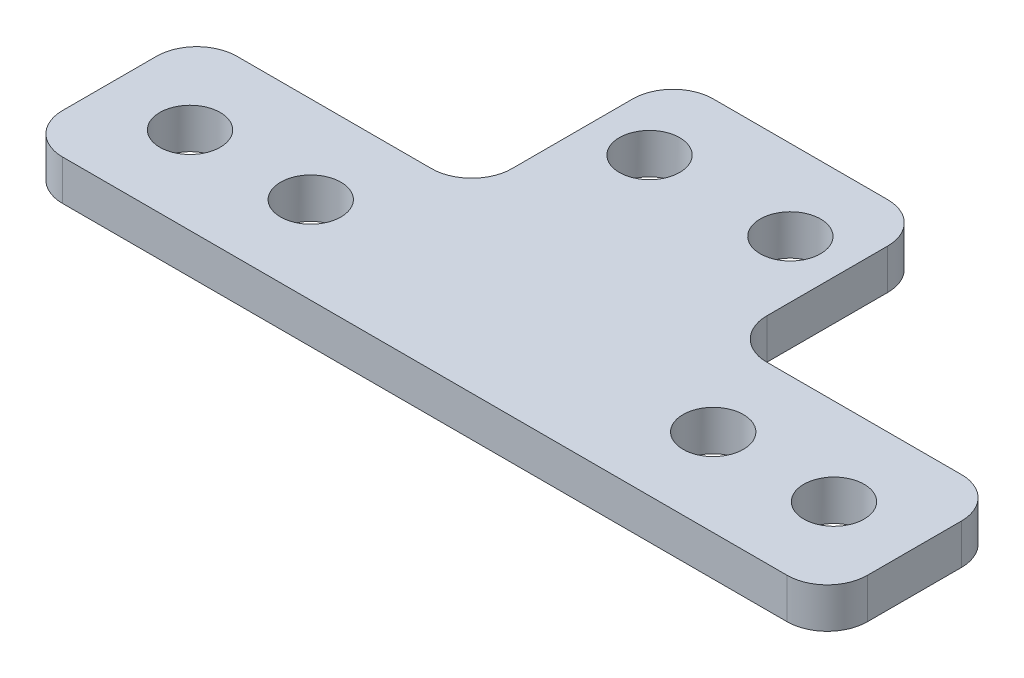
ISO-10303-21;
HEADER;
FILE_DESCRIPTION(('STEP AP214'),'2;1');
FILE_NAME('part.step','',(''),(''),'','','');
FILE_SCHEMA(('AUTOMOTIVE_DESIGN { 1 0 10303 214 1 1 1 1 }'));
ENDSEC;
DATA;
#1=APPLICATION_CONTEXT('core data for automotive mechanical design processes');
#2=APPLICATION_PROTOCOL_DEFINITION('international standard','automotive_design',2000,#1);
#3=PRODUCT_CONTEXT('',#1,'mechanical');
#4=PRODUCT('Part','Part','',(#3));
#5=PRODUCT_RELATED_PRODUCT_CATEGORY('part','',(#4));
#6=PRODUCT_DEFINITION_FORMATION('','',#4);
#7=PRODUCT_DEFINITION_CONTEXT('part definition',#1,'design');
#8=PRODUCT_DEFINITION('design','',#6,#7);
#9=PRODUCT_DEFINITION_SHAPE('','',#8);
#10=(LENGTH_UNIT() NAMED_UNIT(*) SI_UNIT(.MILLI.,.METRE.));
#11=(NAMED_UNIT(*) PLANE_ANGLE_UNIT() SI_UNIT($,.RADIAN.));
#12=(NAMED_UNIT(*) SI_UNIT($,.STERADIAN.) SOLID_ANGLE_UNIT());
#13=UNCERTAINTY_MEASURE_WITH_UNIT(LENGTH_MEASURE(1.E-05),#10,'distance_accuracy_value','');
#14=(GEOMETRIC_REPRESENTATION_CONTEXT(3) GLOBAL_UNCERTAINTY_ASSIGNED_CONTEXT((#13)) GLOBAL_UNIT_ASSIGNED_CONTEXT((#10,
#11,#12)) REPRESENTATION_CONTEXT('',''));
#15=CARTESIAN_POINT('',(0.,0.,0.));
#16=DIRECTION('',(0.,0.,1.));
#17=DIRECTION('',(1.,0.,0.));
#18=AXIS2_PLACEMENT_3D('',#15,#16,#17);
#19=CARTESIAN_POINT('',(-9.5,-3.,-15.));
#20=DIRECTION('',(-1.,0.,0.));
#21=DIRECTION('',(0.,0.,1.));
#22=AXIS2_PLACEMENT_3D('',#19,#20,#21);
#23=PLANE('',#22);
#24=DIRECTION('',(0.,0.,1.));
#25=VECTOR('',#24,1.);
#26=CARTESIAN_POINT('',(-9.5,-3.,-15.));
#27=LINE('',#26,#25);
#28=CARTESIAN_POINT('',(-9.5,-3.,-12.));
#29=VERTEX_POINT('',#28);
#30=CARTESIAN_POINT('',(-9.5,-3.,-3.));
#31=VERTEX_POINT('',#30);
#32=EDGE_CURVE('E305',#29,#31,#27,.T.);
#33=ORIENTED_EDGE('',*,*,#32,.T.);
#34=DIRECTION('',(0.,1.,0.));
#35=VECTOR('',#34,1.);
#36=CARTESIAN_POINT('',(-9.5,0.,-3.));
#37=LINE('',#36,#35);
#38=CARTESIAN_POINT('',(-9.5,0.,-3.));
#39=VERTEX_POINT('',#38);
#40=EDGE_CURVE('E171',#31,#39,#37,.T.);
#41=ORIENTED_EDGE('',*,*,#40,.T.);
#42=DIRECTION('',(0.,0.,1.));
#43=VECTOR('',#42,1.);
#44=CARTESIAN_POINT('',(-9.5,0.,-15.));
#45=LINE('',#44,#43);
#46=CARTESIAN_POINT('',(-9.5,0.,-12.));
#47=VERTEX_POINT('',#46);
#48=EDGE_CURVE('E155',#47,#39,#45,.T.);
#49=ORIENTED_EDGE('',*,*,#48,.F.);
#50=DIRECTION('',(0.,1.,0.));
#51=VECTOR('',#50,1.);
#52=CARTESIAN_POINT('',(-9.5,-3.,-12.));
#53=LINE('',#52,#51);
#54=EDGE_CURVE('E168',#47,#29,#53,.F.);
#55=ORIENTED_EDGE('',*,*,#54,.T.);
#56=EDGE_LOOP('',(#33,#41,#49,#55));
#57=FACE_BOUND('',#56,.T.);
#58=ADVANCED_FACE('F38',(#57),#23,.T.);
#59=CARTESIAN_POINT('',(9.5,-3.,-15.));
#60=DIRECTION('',(0.,0.,-1.));
#61=DIRECTION('',(-1.,0.,0.));
#62=AXIS2_PLACEMENT_3D('',#59,#60,#61);
#63=PLANE('',#62);
#64=DIRECTION('',(-1.,0.,0.));
#65=VECTOR('',#64,1.);
#66=CARTESIAN_POINT('',(9.5,-3.,-15.));
#67=LINE('',#66,#65);
#68=CARTESIAN_POINT('',(6.5,-3.,-15.));
#69=VERTEX_POINT('',#68);
#70=CARTESIAN_POINT('',(-6.5,-3.,-15.));
#71=VERTEX_POINT('',#70);
#72=EDGE_CURVE('E178',#69,#71,#67,.T.);
#73=ORIENTED_EDGE('',*,*,#72,.T.);
#74=DIRECTION('',(0.,1.,0.));
#75=VECTOR('',#74,1.);
#76=CARTESIAN_POINT('',(-6.5,-3.,-15.));
#77=LINE('',#76,#75);
#78=CARTESIAN_POINT('',(-6.5,0.,-15.));
#79=VERTEX_POINT('',#78);
#80=EDGE_CURVE('E204',#71,#79,#77,.T.);
#81=ORIENTED_EDGE('',*,*,#80,.T.);
#82=DIRECTION('',(-1.,0.,0.));
#83=VECTOR('',#82,1.);
#84=CARTESIAN_POINT('',(9.5,0.,-15.));
#85=LINE('',#84,#83);
#86=CARTESIAN_POINT('',(6.5,0.,-15.));
#87=VERTEX_POINT('',#86);
#88=EDGE_CURVE('E157',#87,#79,#85,.T.);
#89=ORIENTED_EDGE('',*,*,#88,.F.);
#90=DIRECTION('',(0.,1.,0.));
#91=VECTOR('',#90,1.);
#92=CARTESIAN_POINT('',(6.5,-3.,-15.));
#93=LINE('',#92,#91);
#94=EDGE_CURVE('E202',#87,#69,#93,.F.);
#95=ORIENTED_EDGE('',*,*,#94,.T.);
#96=EDGE_LOOP('',(#73,#81,#89,#95));
#97=FACE_BOUND('',#96,.T.);
#98=ADVANCED_FACE('F371',(#97),#63,.T.);
#99=CARTESIAN_POINT('',(9.5,-3.,-15.));
#100=DIRECTION('',(1.,0.,0.));
#101=DIRECTION('',(0.,0.,-1.));
#102=AXIS2_PLACEMENT_3D('',#99,#100,#101);
#103=PLANE('',#102);
#104=DIRECTION('',(0.,0.,-1.));
#105=VECTOR('',#104,1.);
#106=CARTESIAN_POINT('',(9.5,0.,-15.));
#107=LINE('',#106,#105);
#108=CARTESIAN_POINT('',(9.5,0.,-3.));
#109=VERTEX_POINT('',#108);
#110=CARTESIAN_POINT('',(9.5,0.,-12.));
#111=VERTEX_POINT('',#110);
#112=EDGE_CURVE('E244',#109,#111,#107,.T.);
#113=ORIENTED_EDGE('',*,*,#112,.F.);
#114=DIRECTION('',(0.,1.,0.));
#115=VECTOR('',#114,1.);
#116=CARTESIAN_POINT('',(9.5,-3.,-3.));
#117=LINE('',#116,#115);
#118=CARTESIAN_POINT('',(9.5,-3.,-3.));
#119=VERTEX_POINT('',#118);
#120=EDGE_CURVE('E200',#109,#119,#117,.F.);
#121=ORIENTED_EDGE('',*,*,#120,.T.);
#122=DIRECTION('',(0.,0.,-1.));
#123=VECTOR('',#122,1.);
#124=CARTESIAN_POINT('',(9.5,-3.,-15.));
#125=LINE('',#124,#123);
#126=CARTESIAN_POINT('',(9.5,-3.,-12.));
#127=VERTEX_POINT('',#126);
#128=EDGE_CURVE('E183',#119,#127,#125,.T.);
#129=ORIENTED_EDGE('',*,*,#128,.T.);
#130=DIRECTION('',(0.,1.,0.));
#131=VECTOR('',#130,1.);
#132=CARTESIAN_POINT('',(9.5,-3.,-12.));
#133=LINE('',#132,#131);
#134=EDGE_CURVE('E197',#127,#111,#133,.T.);
#135=ORIENTED_EDGE('',*,*,#134,.T.);
#136=EDGE_LOOP('',(#113,#121,#129,#135));
#137=FACE_BOUND('',#136,.T.);
#138=ADVANCED_FACE('F251',(#137),#103,.T.);
#139=CARTESIAN_POINT('',(9.5,-3.,0.));
#140=DIRECTION('',(0.,0.,-1.));
#141=DIRECTION('',(-1.,0.,0.));
#142=AXIS2_PLACEMENT_3D('',#139,#140,#141);
#143=PLANE('',#142);
#144=DIRECTION('',(-1.,0.,0.));
#145=VECTOR('',#144,1.);
#146=CARTESIAN_POINT('',(9.5,-3.,0.));
#147=LINE('',#146,#145);
#148=CARTESIAN_POINT('',(27.,-3.,0.));
#149=VERTEX_POINT('',#148);
#150=CARTESIAN_POINT('',(12.5,-3.,0.));
#151=VERTEX_POINT('',#150);
#152=EDGE_CURVE('E260',#149,#151,#147,.T.);
#153=ORIENTED_EDGE('',*,*,#152,.T.);
#154=DIRECTION('',(0.,1.,0.));
#155=VECTOR('',#154,1.);
#156=CARTESIAN_POINT('',(12.5,0.,0.));
#157=LINE('',#156,#155);
#158=CARTESIAN_POINT('',(12.5,0.,0.));
#159=VERTEX_POINT('',#158);
#160=EDGE_CURVE('E194',#151,#159,#157,.T.);
#161=ORIENTED_EDGE('',*,*,#160,.T.);
#162=DIRECTION('',(-1.,0.,0.));
#163=VECTOR('',#162,1.);
#164=CARTESIAN_POINT('',(9.5,0.,0.));
#165=LINE('',#164,#163);
#166=CARTESIAN_POINT('',(27.,0.,0.));
#167=VERTEX_POINT('',#166);
#168=EDGE_CURVE('E246',#167,#159,#165,.T.);
#169=ORIENTED_EDGE('',*,*,#168,.F.);
#170=DIRECTION('',(0.,1.,0.));
#171=VECTOR('',#170,1.);
#172=CARTESIAN_POINT('',(27.,-3.,0.));
#173=LINE('',#172,#171);
#174=EDGE_CURVE('E192',#167,#149,#173,.F.);
#175=ORIENTED_EDGE('',*,*,#174,.T.);
#176=EDGE_LOOP('',(#153,#161,#169,#175));
#177=FACE_BOUND('',#176,.T.);
#178=ADVANCED_FACE('F263',(#177),#143,.T.);
#179=CARTESIAN_POINT('',(30.,-3.,0.));
#180=DIRECTION('',(1.,0.,0.));
#181=DIRECTION('',(0.,0.,-1.));
#182=AXIS2_PLACEMENT_3D('',#179,#180,#181);
#183=PLANE('',#182);
#184=DIRECTION('',(0.,0.,-1.));
#185=VECTOR('',#184,1.);
#186=CARTESIAN_POINT('',(30.,0.,0.));
#187=LINE('',#186,#185);
#188=CARTESIAN_POINT('',(30.,0.,10.));
#189=VERTEX_POINT('',#188);
#190=CARTESIAN_POINT('',(30.,0.,3.));
#191=VERTEX_POINT('',#190);
#192=EDGE_CURVE('E281',#189,#191,#187,.T.);
#193=ORIENTED_EDGE('',*,*,#192,.F.);
#194=DIRECTION('',(0.,1.,0.));
#195=VECTOR('',#194,1.);
#196=CARTESIAN_POINT('',(30.,-3.,10.));
#197=LINE('',#196,#195);
#198=CARTESIAN_POINT('',(30.,-3.,10.));
#199=VERTEX_POINT('',#198);
#200=EDGE_CURVE('E232',#189,#199,#197,.F.);
#201=ORIENTED_EDGE('',*,*,#200,.T.);
#202=DIRECTION('',(0.,0.,-1.));
#203=VECTOR('',#202,1.);
#204=CARTESIAN_POINT('',(30.,-3.,0.));
#205=LINE('',#204,#203);
#206=CARTESIAN_POINT('',(30.,-3.,3.));
#207=VERTEX_POINT('',#206);
#208=EDGE_CURVE('E265',#199,#207,#205,.T.);
#209=ORIENTED_EDGE('',*,*,#208,.T.);
#210=DIRECTION('',(0.,1.,0.));
#211=VECTOR('',#210,1.);
#212=CARTESIAN_POINT('',(30.,-3.,3.));
#213=LINE('',#212,#211);
#214=EDGE_CURVE('E229',#207,#191,#213,.T.);
#215=ORIENTED_EDGE('',*,*,#214,.T.);
#216=EDGE_LOOP('',(#193,#201,#209,#215));
#217=FACE_BOUND('',#216,.T.);
#218=ADVANCED_FACE('F287',(#217),#183,.T.);
#219=CARTESIAN_POINT('',(-30.,-3.,13.));
#220=DIRECTION('',(0.,0.,1.));
#221=DIRECTION('',(1.,0.,0.));
#222=AXIS2_PLACEMENT_3D('',#219,#220,#221);
#223=PLANE('',#222);
#224=DIRECTION('',(1.,0.,0.));
#225=VECTOR('',#224,1.);
#226=CARTESIAN_POINT('',(-30.,-3.,13.));
#227=LINE('',#226,#225);
#228=CARTESIAN_POINT('',(-27.,-3.,13.));
#229=VERTEX_POINT('',#228);
#230=CARTESIAN_POINT('',(27.,-3.,13.));
#231=VERTEX_POINT('',#230);
#232=EDGE_CURVE('E269',#229,#231,#227,.T.);
#233=ORIENTED_EDGE('',*,*,#232,.T.);
#234=DIRECTION('',(0.,1.,0.));
#235=VECTOR('',#234,1.);
#236=CARTESIAN_POINT('',(27.,-3.,13.));
#237=LINE('',#236,#235);
#238=CARTESIAN_POINT('',(27.,0.,13.));
#239=VERTEX_POINT('',#238);
#240=EDGE_CURVE('E226',#231,#239,#237,.T.);
#241=ORIENTED_EDGE('',*,*,#240,.T.);
#242=DIRECTION('',(1.,0.,0.));
#243=VECTOR('',#242,1.);
#244=CARTESIAN_POINT('',(-30.,0.,13.));
#245=LINE('',#244,#243);
#246=CARTESIAN_POINT('',(-27.,0.,13.));
#247=VERTEX_POINT('',#246);
#248=EDGE_CURVE('E278',#247,#239,#245,.T.);
#249=ORIENTED_EDGE('',*,*,#248,.F.);
#250=DIRECTION('',(0.,1.,0.));
#251=VECTOR('',#250,1.);
#252=CARTESIAN_POINT('',(-27.,-3.,13.));
#253=LINE('',#252,#251);
#254=EDGE_CURVE('E224',#247,#229,#253,.F.);
#255=ORIENTED_EDGE('',*,*,#254,.T.);
#256=EDGE_LOOP('',(#233,#241,#249,#255));
#257=FACE_BOUND('',#256,.T.);
#258=ADVANCED_FACE('F296',(#257),#223,.T.);
#259=CARTESIAN_POINT('',(-30.,-3.,0.));
#260=DIRECTION('',(-1.,0.,0.));
#261=DIRECTION('',(0.,0.,1.));
#262=AXIS2_PLACEMENT_3D('',#259,#260,#261);
#263=PLANE('',#262);
#264=DIRECTION('',(0.,0.,1.));
#265=VECTOR('',#264,1.);
#266=CARTESIAN_POINT('',(-30.,-3.,0.));
#267=LINE('',#266,#265);
#268=CARTESIAN_POINT('',(-30.,-3.,3.));
#269=VERTEX_POINT('',#268);
#270=CARTESIAN_POINT('',(-30.,-3.,10.));
#271=VERTEX_POINT('',#270);
#272=EDGE_CURVE('E299',#269,#271,#267,.T.);
#273=ORIENTED_EDGE('',*,*,#272,.T.);
#274=DIRECTION('',(0.,1.,0.));
#275=VECTOR('',#274,1.);
#276=CARTESIAN_POINT('',(-30.,-3.,10.));
#277=LINE('',#276,#275);
#278=CARTESIAN_POINT('',(-30.,0.,10.));
#279=VERTEX_POINT('',#278);
#280=EDGE_CURVE('E235',#271,#279,#277,.T.);
#281=ORIENTED_EDGE('',*,*,#280,.T.);
#282=DIRECTION('',(0.,0.,1.));
#283=VECTOR('',#282,1.);
#284=CARTESIAN_POINT('',(-30.,0.,0.));
#285=LINE('',#284,#283);
#286=CARTESIAN_POINT('',(-30.,0.,3.));
#287=VERTEX_POINT('',#286);
#288=EDGE_CURVE('E275',#287,#279,#285,.T.);
#289=ORIENTED_EDGE('',*,*,#288,.F.);
#290=DIRECTION('',(0.,1.,0.));
#291=VECTOR('',#290,1.);
#292=CARTESIAN_POINT('',(-30.,-3.,3.));
#293=LINE('',#292,#291);
#294=EDGE_CURVE('E60',#287,#269,#293,.F.);
#295=ORIENTED_EDGE('',*,*,#294,.T.);
#296=EDGE_LOOP('',(#273,#281,#289,#295));
#297=FACE_BOUND('',#296,.T.);
#298=ADVANCED_FACE('F407',(#297),#263,.T.);
#299=CARTESIAN_POINT('',(-9.5,-3.,0.));
#300=DIRECTION('',(0.,0.,-1.));
#301=DIRECTION('',(-1.,0.,0.));
#302=AXIS2_PLACEMENT_3D('',#299,#300,#301);
#303=PLANE('',#302);
#304=DIRECTION('',(-1.,0.,0.));
#305=VECTOR('',#304,1.);
#306=CARTESIAN_POINT('',(-9.5,0.,0.));
#307=LINE('',#306,#305);
#308=CARTESIAN_POINT('',(-12.5,0.,0.));
#309=VERTEX_POINT('',#308);
#310=CARTESIAN_POINT('',(-27.,0.,0.));
#311=VERTEX_POINT('',#310);
#312=EDGE_CURVE('E172',#309,#311,#307,.T.);
#313=ORIENTED_EDGE('',*,*,#312,.F.);
#314=DIRECTION('',(0.,1.,0.));
#315=VECTOR('',#314,1.);
#316=CARTESIAN_POINT('',(-12.5,-3.,0.));
#317=LINE('',#316,#315);
#318=CARTESIAN_POINT('',(-12.5,-3.,0.));
#319=VERTEX_POINT('',#318);
#320=EDGE_CURVE('E190',#309,#319,#317,.F.);
#321=ORIENTED_EDGE('',*,*,#320,.T.);
#322=DIRECTION('',(-1.,0.,0.));
#323=VECTOR('',#322,1.);
#324=CARTESIAN_POINT('',(-9.5,-3.,0.));
#325=LINE('',#324,#323);
#326=CARTESIAN_POINT('',(-27.,-3.,0.));
#327=VERTEX_POINT('',#326);
#328=EDGE_CURVE('E300',#319,#327,#325,.T.);
#329=ORIENTED_EDGE('',*,*,#328,.T.);
#330=DIRECTION('',(0.,1.,0.));
#331=VECTOR('',#330,1.);
#332=CARTESIAN_POINT('',(-27.,-3.,0.));
#333=LINE('',#332,#331);
#334=EDGE_CURVE('E180',#327,#311,#333,.T.);
#335=ORIENTED_EDGE('',*,*,#334,.T.);
#336=EDGE_LOOP('',(#313,#321,#329,#335));
#337=FACE_BOUND('',#336,.T.);
#338=ADVANCED_FACE('F380',(#337),#303,.T.);
#339=CARTESIAN_POINT('',(0.,-3.,0.));
#340=DIRECTION('',(0.,-1.,0.));
#341=DIRECTION('',(0.,0.,-1.));
#342=AXIS2_PLACEMENT_3D('',#339,#340,#341);
#343=PLANE('',#342);
#344=CARTESIAN_POINT('',(-5.25,-3.,-9.));
#345=DIRECTION('',(0.,-1.,0.));
#346=DIRECTION('',(0.,0.,-1.));
#347=AXIS2_PLACEMENT_3D('',#344,#345,#346);
#348=CIRCLE('',#347,2.25);
#349=CARTESIAN_POINT('',(-5.25,-3.,-11.25));
#350=VERTEX_POINT('',#349);
#351=EDGE_CURVE('E336',#350,#350,#348,.T.);
#352=ORIENTED_EDGE('',*,*,#351,.F.);
#353=EDGE_LOOP('',(#352));
#354=FACE_BOUND('',#353,.T.);
#355=CARTESIAN_POINT('',(5.25,-3.,-9.));
#356=DIRECTION('',(0.,-1.,0.));
#357=DIRECTION('',(0.,0.,-1.));
#358=AXIS2_PLACEMENT_3D('',#355,#356,#357);
#359=CIRCLE('',#358,2.25);
#360=CARTESIAN_POINT('',(5.25,-3.,-11.25));
#361=VERTEX_POINT('',#360);
#362=EDGE_CURVE('E330',#361,#361,#359,.T.);
#363=ORIENTED_EDGE('',*,*,#362,.F.);
#364=EDGE_LOOP('',(#363));
#365=FACE_BOUND('',#364,.T.);
#366=CARTESIAN_POINT('',(-15.,-3.,6.5));
#367=DIRECTION('',(0.,-1.,0.));
#368=DIRECTION('',(0.,0.,-1.));
#369=AXIS2_PLACEMENT_3D('',#366,#367,#368);
#370=CIRCLE('',#369,2.25);
#371=CARTESIAN_POINT('',(-15.,-3.,4.25));
#372=VERTEX_POINT('',#371);
#373=EDGE_CURVE('E324',#372,#372,#370,.T.);
#374=ORIENTED_EDGE('',*,*,#373,.F.);
#375=EDGE_LOOP('',(#374));
#376=FACE_BOUND('',#375,.T.);
#377=CARTESIAN_POINT('',(15.,-3.,6.5));
#378=DIRECTION('',(0.,-1.,0.));
#379=DIRECTION('',(0.,0.,-1.));
#380=AXIS2_PLACEMENT_3D('',#377,#378,#379);
#381=CIRCLE('',#380,2.25);
#382=CARTESIAN_POINT('',(15.,-3.,4.25));
#383=VERTEX_POINT('',#382);
#384=EDGE_CURVE('E318',#383,#383,#381,.T.);
#385=ORIENTED_EDGE('',*,*,#384,.F.);
#386=EDGE_LOOP('',(#385));
#387=FACE_BOUND('',#386,.T.);
#388=CARTESIAN_POINT('',(-24.,-3.,6.5));
#389=DIRECTION('',(0.,-1.,0.));
#390=DIRECTION('',(0.,0.,-1.));
#391=AXIS2_PLACEMENT_3D('',#388,#389,#390);
#392=CIRCLE('',#391,2.25);
#393=CARTESIAN_POINT('',(-24.,-3.,4.25));
#394=VERTEX_POINT('',#393);
#395=EDGE_CURVE('E312',#394,#394,#392,.T.);
#396=ORIENTED_EDGE('',*,*,#395,.F.);
#397=EDGE_LOOP('',(#396));
#398=FACE_BOUND('',#397,.T.);
#399=CARTESIAN_POINT('',(24.,-3.,6.5));
#400=DIRECTION('',(0.,-1.,0.));
#401=DIRECTION('',(0.,0.,-1.));
#402=AXIS2_PLACEMENT_3D('',#399,#400,#401);
#403=CIRCLE('',#402,2.25);
#404=CARTESIAN_POINT('',(24.,-3.,4.25));
#405=VERTEX_POINT('',#404);
#406=EDGE_CURVE('E173',#405,#405,#403,.T.);
#407=ORIENTED_EDGE('',*,*,#406,.F.);
#408=EDGE_LOOP('',(#407));
#409=FACE_BOUND('',#408,.T.);
#410=ORIENTED_EDGE('',*,*,#32,.F.);
#411=CARTESIAN_POINT('',(-6.5,-3.,-12.));
#412=DIRECTION('',(0.,-1.,0.));
#413=DIRECTION('',(0.,0.,-1.));
#414=AXIS2_PLACEMENT_3D('',#411,#412,#413);
#415=CIRCLE('',#414,3.);
#416=EDGE_CURVE('E177',#29,#71,#415,.T.);
#417=ORIENTED_EDGE('',*,*,#416,.T.);
#418=ORIENTED_EDGE('',*,*,#72,.F.);
#419=CARTESIAN_POINT('',(6.5,-3.,-12.));
#420=DIRECTION('',(0.,-1.,0.));
#421=DIRECTION('',(0.,0.,-1.));
#422=AXIS2_PLACEMENT_3D('',#419,#420,#421);
#423=CIRCLE('',#422,3.);
#424=EDGE_CURVE('E221',#69,#127,#423,.T.);
#425=ORIENTED_EDGE('',*,*,#424,.T.);
#426=ORIENTED_EDGE('',*,*,#128,.F.);
#427=CARTESIAN_POINT('',(12.5,-3.,-3.));
#428=DIRECTION('',(0.,-1.,0.));
#429=DIRECTION('',(0.,0.,-1.));
#430=AXIS2_PLACEMENT_3D('',#427,#428,#429);
#431=CIRCLE('',#430,3.);
#432=EDGE_CURVE('E11',#119,#151,#431,.F.);
#433=ORIENTED_EDGE('',*,*,#432,.T.);
#434=ORIENTED_EDGE('',*,*,#152,.F.);
#435=CARTESIAN_POINT('',(27.,-3.,3.));
#436=DIRECTION('',(0.,-1.,0.));
#437=DIRECTION('',(0.,0.,-1.));
#438=AXIS2_PLACEMENT_3D('',#435,#436,#437);
#439=CIRCLE('',#438,3.);
#440=EDGE_CURVE('E217',#149,#207,#439,.T.);
#441=ORIENTED_EDGE('',*,*,#440,.T.);
#442=ORIENTED_EDGE('',*,*,#208,.F.);
#443=CARTESIAN_POINT('',(27.,-3.,10.));
#444=DIRECTION('',(0.,-1.,0.));
#445=DIRECTION('',(0.,0.,-1.));
#446=AXIS2_PLACEMENT_3D('',#443,#444,#445);
#447=CIRCLE('',#446,3.);
#448=EDGE_CURVE('E219',#199,#231,#447,.T.);
#449=ORIENTED_EDGE('',*,*,#448,.T.);
#450=ORIENTED_EDGE('',*,*,#232,.F.);
#451=CARTESIAN_POINT('',(-27.,-3.,10.));
#452=DIRECTION('',(0.,-1.,0.));
#453=DIRECTION('',(0.,0.,-1.));
#454=AXIS2_PLACEMENT_3D('',#451,#452,#453);
#455=CIRCLE('',#454,3.);
#456=EDGE_CURVE('E53',#229,#271,#455,.T.);
#457=ORIENTED_EDGE('',*,*,#456,.T.);
#458=ORIENTED_EDGE('',*,*,#272,.F.);
#459=CARTESIAN_POINT('',(-27.,-3.,3.));
#460=DIRECTION('',(0.,-1.,0.));
#461=DIRECTION('',(0.,0.,-1.));
#462=AXIS2_PLACEMENT_3D('',#459,#460,#461);
#463=CIRCLE('',#462,3.);
#464=EDGE_CURVE('E162',#269,#327,#463,.T.);
#465=ORIENTED_EDGE('',*,*,#464,.T.);
#466=ORIENTED_EDGE('',*,*,#328,.F.);
#467=CARTESIAN_POINT('',(-12.5,-3.,-3.));
#468=DIRECTION('',(0.,-1.,0.));
#469=DIRECTION('',(0.,0.,-1.));
#470=AXIS2_PLACEMENT_3D('',#467,#468,#469);
#471=CIRCLE('',#470,3.);
#472=EDGE_CURVE('E240',#319,#31,#471,.F.);
#473=ORIENTED_EDGE('',*,*,#472,.T.);
#474=EDGE_LOOP('',(#410,#417,#418,#425,#426,#433,#434,#441,#442,#449,#450,#457,#458,#465,#466,#473));
#475=FACE_BOUND('',#474,.T.);
#476=ADVANCED_FACE('F259',(#354,#365,#376,#387,#398,#409,#475),#343,.T.);
#477=CARTESIAN_POINT('',(0.,0.,0.));
#478=DIRECTION('',(0.,-1.,0.));
#479=DIRECTION('',(0.,0.,-1.));
#480=AXIS2_PLACEMENT_3D('',#477,#478,#479);
#481=PLANE('',#480);
#482=CARTESIAN_POINT('',(-5.25,0.,-9.));
#483=DIRECTION('',(0.,1.,0.));
#484=DIRECTION('',(0.,0.,1.));
#485=AXIS2_PLACEMENT_3D('',#482,#483,#484);
#486=CIRCLE('',#485,2.25);
#487=CARTESIAN_POINT('',(-5.25,0.,-6.75));
#488=VERTEX_POINT('',#487);
#489=EDGE_CURVE('E339',#488,#488,#486,.T.);
#490=ORIENTED_EDGE('',*,*,#489,.F.);
#491=EDGE_LOOP('',(#490));
#492=FACE_BOUND('',#491,.T.);
#493=CARTESIAN_POINT('',(5.25,0.,-9.));
#494=DIRECTION('',(0.,1.,0.));
#495=DIRECTION('',(0.,0.,1.));
#496=AXIS2_PLACEMENT_3D('',#493,#494,#495);
#497=CIRCLE('',#496,2.25);
#498=CARTESIAN_POINT('',(5.25,0.,-6.75));
#499=VERTEX_POINT('',#498);
#500=EDGE_CURVE('E333',#499,#499,#497,.T.);
#501=ORIENTED_EDGE('',*,*,#500,.F.);
#502=EDGE_LOOP('',(#501));
#503=FACE_BOUND('',#502,.T.);
#504=CARTESIAN_POINT('',(-15.,0.,6.5));
#505=DIRECTION('',(0.,1.,0.));
#506=DIRECTION('',(0.,0.,1.));
#507=AXIS2_PLACEMENT_3D('',#504,#505,#506);
#508=CIRCLE('',#507,2.25);
#509=CARTESIAN_POINT('',(-15.,0.,8.75));
#510=VERTEX_POINT('',#509);
#511=EDGE_CURVE('E327',#510,#510,#508,.T.);
#512=ORIENTED_EDGE('',*,*,#511,.F.);
#513=EDGE_LOOP('',(#512));
#514=FACE_BOUND('',#513,.T.);
#515=CARTESIAN_POINT('',(15.,0.,6.5));
#516=DIRECTION('',(0.,1.,0.));
#517=DIRECTION('',(0.,0.,1.));
#518=AXIS2_PLACEMENT_3D('',#515,#516,#517);
#519=CIRCLE('',#518,2.25);
#520=CARTESIAN_POINT('',(15.,0.,8.75));
#521=VERTEX_POINT('',#520);
#522=EDGE_CURVE('E321',#521,#521,#519,.T.);
#523=ORIENTED_EDGE('',*,*,#522,.F.);
#524=EDGE_LOOP('',(#523));
#525=FACE_BOUND('',#524,.T.);
#526=CARTESIAN_POINT('',(-24.,0.,6.5));
#527=DIRECTION('',(0.,1.,0.));
#528=DIRECTION('',(0.,0.,1.));
#529=AXIS2_PLACEMENT_3D('',#526,#527,#528);
#530=CIRCLE('',#529,2.25);
#531=CARTESIAN_POINT('',(-24.,0.,8.75));
#532=VERTEX_POINT('',#531);
#533=EDGE_CURVE('E315',#532,#532,#530,.T.);
#534=ORIENTED_EDGE('',*,*,#533,.F.);
#535=EDGE_LOOP('',(#534));
#536=FACE_BOUND('',#535,.T.);
#537=CARTESIAN_POINT('',(24.,0.,6.5));
#538=DIRECTION('',(0.,1.,0.));
#539=DIRECTION('',(0.,0.,1.));
#540=AXIS2_PLACEMENT_3D('',#537,#538,#539);
#541=CIRCLE('',#540,2.25);
#542=CARTESIAN_POINT('',(24.,0.,8.75));
#543=VERTEX_POINT('',#542);
#544=EDGE_CURVE('E309',#543,#543,#541,.T.);
#545=ORIENTED_EDGE('',*,*,#544,.F.);
#546=EDGE_LOOP('',(#545));
#547=FACE_BOUND('',#546,.T.);
#548=ORIENTED_EDGE('',*,*,#88,.T.);
#549=CARTESIAN_POINT('',(-6.5,0.,-12.));
#550=DIRECTION('',(0.,-1.,0.));
#551=DIRECTION('',(0.,0.,-1.));
#552=AXIS2_PLACEMENT_3D('',#549,#550,#551);
#553=CIRCLE('',#552,3.);
#554=EDGE_CURVE('E152',#79,#47,#553,.F.);
#555=ORIENTED_EDGE('',*,*,#554,.T.);
#556=ORIENTED_EDGE('',*,*,#48,.T.);
#557=CARTESIAN_POINT('',(-12.5,0.,-3.));
#558=DIRECTION('',(0.,-1.,0.));
#559=DIRECTION('',(0.,0.,-1.));
#560=AXIS2_PLACEMENT_3D('',#557,#558,#559);
#561=CIRCLE('',#560,3.);
#562=EDGE_CURVE('E238',#39,#309,#561,.T.);
#563=ORIENTED_EDGE('',*,*,#562,.T.);
#564=ORIENTED_EDGE('',*,*,#312,.T.);
#565=CARTESIAN_POINT('',(-27.,0.,3.));
#566=DIRECTION('',(0.,-1.,0.));
#567=DIRECTION('',(0.,0.,-1.));
#568=AXIS2_PLACEMENT_3D('',#565,#566,#567);
#569=CIRCLE('',#568,3.);
#570=EDGE_CURVE('E206',#311,#287,#569,.F.);
#571=ORIENTED_EDGE('',*,*,#570,.T.);
#572=ORIENTED_EDGE('',*,*,#288,.T.);
#573=CARTESIAN_POINT('',(-27.,0.,10.));
#574=DIRECTION('',(0.,-1.,0.));
#575=DIRECTION('',(0.,0.,-1.));
#576=AXIS2_PLACEMENT_3D('',#573,#574,#575);
#577=CIRCLE('',#576,3.);
#578=EDGE_CURVE('E208',#279,#247,#577,.F.);
#579=ORIENTED_EDGE('',*,*,#578,.T.);
#580=ORIENTED_EDGE('',*,*,#248,.T.);
#581=CARTESIAN_POINT('',(27.,0.,10.));
#582=DIRECTION('',(0.,-1.,0.));
#583=DIRECTION('',(0.,0.,-1.));
#584=AXIS2_PLACEMENT_3D('',#581,#582,#583);
#585=CIRCLE('',#584,3.);
#586=EDGE_CURVE('E212',#239,#189,#585,.F.);
#587=ORIENTED_EDGE('',*,*,#586,.T.);
#588=ORIENTED_EDGE('',*,*,#192,.T.);
#589=CARTESIAN_POINT('',(27.,0.,3.));
#590=DIRECTION('',(0.,-1.,0.));
#591=DIRECTION('',(0.,0.,-1.));
#592=AXIS2_PLACEMENT_3D('',#589,#590,#591);
#593=CIRCLE('',#592,3.);
#594=EDGE_CURVE('E210',#191,#167,#593,.F.);
#595=ORIENTED_EDGE('',*,*,#594,.T.);
#596=ORIENTED_EDGE('',*,*,#168,.T.);
#597=CARTESIAN_POINT('',(12.5,0.,-3.));
#598=DIRECTION('',(0.,-1.,0.));
#599=DIRECTION('',(0.,0.,-1.));
#600=AXIS2_PLACEMENT_3D('',#597,#598,#599);
#601=CIRCLE('',#600,3.);
#602=EDGE_CURVE('E46',#159,#109,#601,.T.);
#603=ORIENTED_EDGE('',*,*,#602,.T.);
#604=ORIENTED_EDGE('',*,*,#112,.T.);
#605=CARTESIAN_POINT('',(6.5,0.,-12.));
#606=DIRECTION('',(0.,-1.,0.));
#607=DIRECTION('',(0.,0.,-1.));
#608=AXIS2_PLACEMENT_3D('',#605,#606,#607);
#609=CIRCLE('',#608,3.);
#610=EDGE_CURVE('E163',#111,#87,#609,.F.);
#611=ORIENTED_EDGE('',*,*,#610,.T.);
#612=EDGE_LOOP('',(#548,#555,#556,#563,#564,#571,#572,#579,#580,#587,#588,#595,#596,#603,#604,#611));
#613=FACE_BOUND('',#612,.T.);
#614=ADVANCED_FACE('F154',(#492,#503,#514,#525,#536,#547,#613),#481,.F.);
#615=CARTESIAN_POINT('',(24.,0.,6.5));
#616=DIRECTION('',(0.,1.,0.));
#617=DIRECTION('',(0.,0.,1.));
#618=AXIS2_PLACEMENT_3D('',#615,#616,#617);
#619=CYLINDRICAL_SURFACE('',#618,2.25);
#620=ORIENTED_EDGE('',*,*,#406,.T.);
#621=EDGE_LOOP('',(#620));
#622=FACE_BOUND('',#621,.T.);
#623=ORIENTED_EDGE('',*,*,#544,.T.);
#624=EDGE_LOOP('',(#623));
#625=FACE_BOUND('',#624,.T.);
#626=ADVANCED_FACE('F347',(#622,#625),#619,.F.);
#627=CARTESIAN_POINT('',(-24.,0.,6.5));
#628=DIRECTION('',(0.,1.,0.));
#629=DIRECTION('',(0.,0.,1.));
#630=AXIS2_PLACEMENT_3D('',#627,#628,#629);
#631=CYLINDRICAL_SURFACE('',#630,2.25);
#632=ORIENTED_EDGE('',*,*,#395,.T.);
#633=EDGE_LOOP('',(#632));
#634=FACE_BOUND('',#633,.T.);
#635=ORIENTED_EDGE('',*,*,#533,.T.);
#636=EDGE_LOOP('',(#635));
#637=FACE_BOUND('',#636,.T.);
#638=ADVANCED_FACE('F360',(#634,#637),#631,.F.);
#639=CARTESIAN_POINT('',(15.,0.,6.5));
#640=DIRECTION('',(0.,1.,0.));
#641=DIRECTION('',(0.,0.,1.));
#642=AXIS2_PLACEMENT_3D('',#639,#640,#641);
#643=CYLINDRICAL_SURFACE('',#642,2.25);
#644=ORIENTED_EDGE('',*,*,#384,.T.);
#645=EDGE_LOOP('',(#644));
#646=FACE_BOUND('',#645,.T.);
#647=ORIENTED_EDGE('',*,*,#522,.T.);
#648=EDGE_LOOP('',(#647));
#649=FACE_BOUND('',#648,.T.);
#650=ADVANCED_FACE('F366',(#646,#649),#643,.F.);
#651=CARTESIAN_POINT('',(-15.,0.,6.5));
#652=DIRECTION('',(0.,1.,0.));
#653=DIRECTION('',(0.,0.,1.));
#654=AXIS2_PLACEMENT_3D('',#651,#652,#653);
#655=CYLINDRICAL_SURFACE('',#654,2.25);
#656=ORIENTED_EDGE('',*,*,#373,.T.);
#657=EDGE_LOOP('',(#656));
#658=FACE_BOUND('',#657,.T.);
#659=ORIENTED_EDGE('',*,*,#511,.T.);
#660=EDGE_LOOP('',(#659));
#661=FACE_BOUND('',#660,.T.);
#662=ADVANCED_FACE('F538',(#658,#661),#655,.F.);
#663=CARTESIAN_POINT('',(5.25,0.,-9.));
#664=DIRECTION('',(0.,1.,0.));
#665=DIRECTION('',(0.,0.,1.));
#666=AXIS2_PLACEMENT_3D('',#663,#664,#665);
#667=CYLINDRICAL_SURFACE('',#666,2.25);
#668=ORIENTED_EDGE('',*,*,#362,.T.);
#669=EDGE_LOOP('',(#668));
#670=FACE_BOUND('',#669,.T.);
#671=ORIENTED_EDGE('',*,*,#500,.T.);
#672=EDGE_LOOP('',(#671));
#673=FACE_BOUND('',#672,.T.);
#674=ADVANCED_FACE('F531',(#670,#673),#667,.F.);
#675=CARTESIAN_POINT('',(-5.25,0.,-9.));
#676=DIRECTION('',(0.,1.,0.));
#677=DIRECTION('',(0.,0.,1.));
#678=AXIS2_PLACEMENT_3D('',#675,#676,#677);
#679=CYLINDRICAL_SURFACE('',#678,2.25);
#680=ORIENTED_EDGE('',*,*,#351,.T.);
#681=EDGE_LOOP('',(#680));
#682=FACE_BOUND('',#681,.T.);
#683=ORIENTED_EDGE('',*,*,#489,.T.);
#684=EDGE_LOOP('',(#683));
#685=FACE_BOUND('',#684,.T.);
#686=ADVANCED_FACE('F343',(#682,#685),#679,.F.);
#687=CARTESIAN_POINT('',(-12.5,-3.,-3.));
#688=DIRECTION('',(0.,-1.,0.));
#689=DIRECTION('',(0.,0.,-1.));
#690=AXIS2_PLACEMENT_3D('',#687,#688,#689);
#691=CYLINDRICAL_SURFACE('',#690,3.);
#692=ORIENTED_EDGE('',*,*,#472,.F.);
#693=ORIENTED_EDGE('',*,*,#320,.F.);
#694=ORIENTED_EDGE('',*,*,#562,.F.);
#695=ORIENTED_EDGE('',*,*,#40,.F.);
#696=EDGE_LOOP('',(#692,#693,#694,#695));
#697=FACE_BOUND('',#696,.T.);
#698=ADVANCED_FACE('F382',(#697),#691,.F.);
#699=CARTESIAN_POINT('',(12.5,-3.,-3.));
#700=DIRECTION('',(0.,-1.,0.));
#701=DIRECTION('',(0.,0.,-1.));
#702=AXIS2_PLACEMENT_3D('',#699,#700,#701);
#703=CYLINDRICAL_SURFACE('',#702,3.);
#704=ORIENTED_EDGE('',*,*,#432,.F.);
#705=ORIENTED_EDGE('',*,*,#120,.F.);
#706=ORIENTED_EDGE('',*,*,#602,.F.);
#707=ORIENTED_EDGE('',*,*,#160,.F.);
#708=EDGE_LOOP('',(#704,#705,#706,#707));
#709=FACE_BOUND('',#708,.T.);
#710=ADVANCED_FACE('F256',(#709),#703,.F.);
#711=CARTESIAN_POINT('',(-6.5,-3.,-12.));
#712=DIRECTION('',(0.,1.,0.));
#713=DIRECTION('',(0.,0.,1.));
#714=AXIS2_PLACEMENT_3D('',#711,#712,#713);
#715=CYLINDRICAL_SURFACE('',#714,3.);
#716=ORIENTED_EDGE('',*,*,#416,.F.);
#717=ORIENTED_EDGE('',*,*,#54,.F.);
#718=ORIENTED_EDGE('',*,*,#554,.F.);
#719=ORIENTED_EDGE('',*,*,#80,.F.);
#720=EDGE_LOOP('',(#716,#717,#718,#719));
#721=FACE_BOUND('',#720,.T.);
#722=ADVANCED_FACE('F176',(#721),#715,.T.);
#723=CARTESIAN_POINT('',(6.5,-3.,-12.));
#724=DIRECTION('',(0.,1.,0.));
#725=DIRECTION('',(0.,0.,1.));
#726=AXIS2_PLACEMENT_3D('',#723,#724,#725);
#727=CYLINDRICAL_SURFACE('',#726,3.);
#728=ORIENTED_EDGE('',*,*,#424,.F.);
#729=ORIENTED_EDGE('',*,*,#94,.F.);
#730=ORIENTED_EDGE('',*,*,#610,.F.);
#731=ORIENTED_EDGE('',*,*,#134,.F.);
#732=EDGE_LOOP('',(#728,#729,#730,#731));
#733=FACE_BOUND('',#732,.T.);
#734=ADVANCED_FACE('F390',(#733),#727,.T.);
#735=CARTESIAN_POINT('',(27.,-3.,10.));
#736=DIRECTION('',(0.,1.,0.));
#737=DIRECTION('',(0.,0.,1.));
#738=AXIS2_PLACEMENT_3D('',#735,#736,#737);
#739=CYLINDRICAL_SURFACE('',#738,3.);
#740=ORIENTED_EDGE('',*,*,#448,.F.);
#741=ORIENTED_EDGE('',*,*,#200,.F.);
#742=ORIENTED_EDGE('',*,*,#586,.F.);
#743=ORIENTED_EDGE('',*,*,#240,.F.);
#744=EDGE_LOOP('',(#740,#741,#742,#743));
#745=FACE_BOUND('',#744,.T.);
#746=ADVANCED_FACE('F292',(#745),#739,.T.);
#747=CARTESIAN_POINT('',(27.,-3.,3.));
#748=DIRECTION('',(0.,1.,0.));
#749=DIRECTION('',(0.,0.,1.));
#750=AXIS2_PLACEMENT_3D('',#747,#748,#749);
#751=CYLINDRICAL_SURFACE('',#750,3.);
#752=ORIENTED_EDGE('',*,*,#440,.F.);
#753=ORIENTED_EDGE('',*,*,#174,.F.);
#754=ORIENTED_EDGE('',*,*,#594,.F.);
#755=ORIENTED_EDGE('',*,*,#214,.F.);
#756=EDGE_LOOP('',(#752,#753,#754,#755));
#757=FACE_BOUND('',#756,.T.);
#758=ADVANCED_FACE('F396',(#757),#751,.T.);
#759=CARTESIAN_POINT('',(-27.,-3.,10.));
#760=DIRECTION('',(0.,1.,0.));
#761=DIRECTION('',(0.,0.,1.));
#762=AXIS2_PLACEMENT_3D('',#759,#760,#761);
#763=CYLINDRICAL_SURFACE('',#762,3.);
#764=ORIENTED_EDGE('',*,*,#456,.F.);
#765=ORIENTED_EDGE('',*,*,#254,.F.);
#766=ORIENTED_EDGE('',*,*,#578,.F.);
#767=ORIENTED_EDGE('',*,*,#280,.F.);
#768=EDGE_LOOP('',(#764,#765,#766,#767));
#769=FACE_BOUND('',#768,.T.);
#770=ADVANCED_FACE('F398',(#769),#763,.T.);
#771=CARTESIAN_POINT('',(-27.,-3.,3.));
#772=DIRECTION('',(0.,1.,0.));
#773=DIRECTION('',(0.,0.,1.));
#774=AXIS2_PLACEMENT_3D('',#771,#772,#773);
#775=CYLINDRICAL_SURFACE('',#774,3.);
#776=ORIENTED_EDGE('',*,*,#464,.F.);
#777=ORIENTED_EDGE('',*,*,#294,.F.);
#778=ORIENTED_EDGE('',*,*,#570,.F.);
#779=ORIENTED_EDGE('',*,*,#334,.F.);
#780=EDGE_LOOP('',(#776,#777,#778,#779));
#781=FACE_BOUND('',#780,.T.);
#782=ADVANCED_FACE('F40',(#781),#775,.T.);
#783=CLOSED_SHELL('',(#58,#98,#138,#178,#218,#258,#298,#338,#476,#614,#626,#638,#650,#662,#674,
#686,#698,#710,#722,#734,#746,#758,#770,#782));
#784=MANIFOLD_SOLID_BREP('B2',#783);
#785=ADVANCED_BREP_SHAPE_REPRESENTATION('',(#18,#784),#14);
#786=SHAPE_DEFINITION_REPRESENTATION(#9,#785);
ENDSEC;
END-ISO-10303-21;
